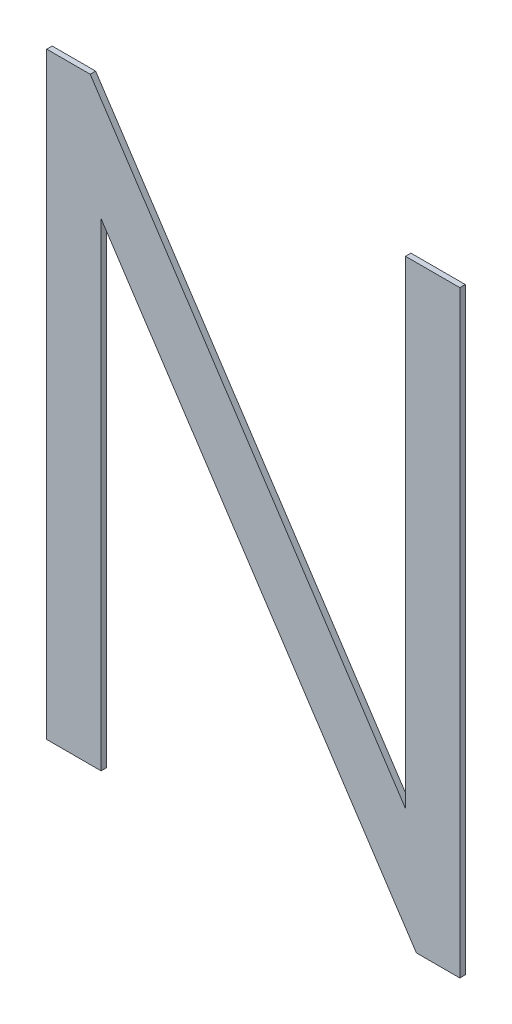
ISO-10303-21;
HEADER;
FILE_DESCRIPTION(('STEP AP214'),'2;1');
FILE_NAME('part.step','',(''),(''),'','','');
FILE_SCHEMA(('AUTOMOTIVE_DESIGN { 1 0 10303 214 1 1 1 1 }'));
ENDSEC;
DATA;
#1=APPLICATION_CONTEXT('core data for automotive mechanical design processes');
#2=APPLICATION_PROTOCOL_DEFINITION('international standard','automotive_design',2000,#1);
#3=PRODUCT_CONTEXT('',#1,'mechanical');
#4=PRODUCT('Part','Part','',(#3));
#5=PRODUCT_RELATED_PRODUCT_CATEGORY('part','',(#4));
#6=PRODUCT_DEFINITION_FORMATION('','',#4);
#7=PRODUCT_DEFINITION_CONTEXT('part definition',#1,'design');
#8=PRODUCT_DEFINITION('design','',#6,#7);
#9=PRODUCT_DEFINITION_SHAPE('','',#8);
#10=(LENGTH_UNIT() NAMED_UNIT(*) SI_UNIT(.MILLI.,.METRE.));
#11=(NAMED_UNIT(*) PLANE_ANGLE_UNIT() SI_UNIT($,.RADIAN.));
#12=(NAMED_UNIT(*) SI_UNIT($,.STERADIAN.) SOLID_ANGLE_UNIT());
#13=UNCERTAINTY_MEASURE_WITH_UNIT(LENGTH_MEASURE(1.E-05),#10,'distance_accuracy_value','');
#14=(GEOMETRIC_REPRESENTATION_CONTEXT(3) GLOBAL_UNCERTAINTY_ASSIGNED_CONTEXT((#13)) GLOBAL_UNIT_ASSIGNED_CONTEXT((#10,
#11,#12)) REPRESENTATION_CONTEXT('',''));
#15=CARTESIAN_POINT('',(0.,0.,0.));
#16=DIRECTION('',(0.,0.,1.));
#17=DIRECTION('',(1.,0.,0.));
#18=AXIS2_PLACEMENT_3D('',#15,#16,#17);
#19=CARTESIAN_POINT('',(-0.37999924,-0.5499989,0.01));
#20=DIRECTION('',(0.,0.,1.));
#21=DIRECTION('',(1.,0.,0.));
#22=AXIS2_PLACEMENT_3D('',#19,#20,#21);
#23=PLANE('',#22);
#24=DIRECTION('',(1.,0.,0.));
#25=VECTOR('',#24,1.);
#26=CARTESIAN_POINT('',(-0.37999924,0.55000144,0.01));
#27=LINE('',#26,#25);
#28=CARTESIAN_POINT('',(-0.37999924,0.55000144,0.01));
#29=VERTEX_POINT('',#28);
#30=CARTESIAN_POINT('',(-0.2999994,0.55000144,0.01));
#31=VERTEX_POINT('',#30);
#32=EDGE_CURVE('E137',#29,#31,#27,.T.);
#33=ORIENTED_EDGE('',*,*,#32,.F.);
#34=DIRECTION('',(0.,1.,0.));
#35=VECTOR('',#34,1.);
#36=CARTESIAN_POINT('',(-0.37999924,-0.5499989,0.01));
#37=LINE('',#36,#35);
#38=CARTESIAN_POINT('',(-0.37999924,-0.5499989,0.01));
#39=VERTEX_POINT('',#38);
#40=EDGE_CURVE('E106',#39,#29,#37,.T.);
#41=ORIENTED_EDGE('',*,*,#40,.F.);
#42=DIRECTION('',(1.,0.,0.));
#43=VECTOR('',#42,1.);
#44=CARTESIAN_POINT('',(-0.27999944,-0.5499989,0.01));
#45=LINE('',#44,#43);
#46=CARTESIAN_POINT('',(-0.27999944,-0.5499989,0.01));
#47=VERTEX_POINT('',#46);
#48=EDGE_CURVE('E20',#47,#39,#45,.F.);
#49=ORIENTED_EDGE('',*,*,#48,.F.);
#50=DIRECTION('',(0.,1.,0.));
#51=VECTOR('',#50,1.);
#52=CARTESIAN_POINT('',(-0.27999944,0.33000188,0.01));
#53=LINE('',#52,#51);
#54=CARTESIAN_POINT('',(-0.279999440000009,0.330001879999994,0.01));
#55=VERTEX_POINT('',#54);
#56=EDGE_CURVE('E95',#55,#47,#53,.F.);
#57=ORIENTED_EDGE('',*,*,#56,.F.);
#58=DIRECTION('',(0.55031225476894,-0.834958934469909,0.));
#59=VECTOR('',#58,1.);
#60=CARTESIAN_POINT('',(0.2999994,-0.5499989,0.01));
#61=LINE('',#60,#59);
#62=CARTESIAN_POINT('',(0.2999994,-0.5499989,0.01));
#63=VERTEX_POINT('',#62);
#64=EDGE_CURVE('E90',#63,#55,#61,.F.);
#65=ORIENTED_EDGE('',*,*,#64,.F.);
#66=DIRECTION('',(1.,0.,0.));
#67=VECTOR('',#66,1.);
#68=CARTESIAN_POINT('',(0.37999924,-0.5499989,0.01));
#69=LINE('',#68,#67);
#70=CARTESIAN_POINT('',(0.37999924,-0.5499989,0.01));
#71=VERTEX_POINT('',#70);
#72=EDGE_CURVE('E117',#71,#63,#69,.F.);
#73=ORIENTED_EDGE('',*,*,#72,.F.);
#74=DIRECTION('',(0.,1.,0.));
#75=VECTOR('',#74,1.);
#76=CARTESIAN_POINT('',(0.37999924,0.55000144,0.01));
#77=LINE('',#76,#75);
#78=CARTESIAN_POINT('',(0.37999924,0.55000144,0.01));
#79=VERTEX_POINT('',#78);
#80=EDGE_CURVE('E121',#79,#71,#77,.F.);
#81=ORIENTED_EDGE('',*,*,#80,.F.);
#82=DIRECTION('',(1.,0.,0.));
#83=VECTOR('',#82,1.);
#84=CARTESIAN_POINT('',(0.27999944,0.55000144,0.01));
#85=LINE('',#84,#83);
#86=CARTESIAN_POINT('',(0.27999944,0.55000144,0.01));
#87=VERTEX_POINT('',#86);
#88=EDGE_CURVE('E125',#87,#79,#85,.T.);
#89=ORIENTED_EDGE('',*,*,#88,.F.);
#90=DIRECTION('',(0.,1.,0.));
#91=VECTOR('',#90,1.);
#92=CARTESIAN_POINT('',(0.27999944,-0.32999934,0.01));
#93=LINE('',#92,#91);
#94=CARTESIAN_POINT('',(0.279999440000009,-0.329999339999994,0.01));
#95=VERTEX_POINT('',#94);
#96=EDGE_CURVE('E129',#95,#87,#93,.T.);
#97=ORIENTED_EDGE('',*,*,#96,.F.);
#98=DIRECTION('',(-0.55031225476894,0.834958934469909,0.));
#99=VECTOR('',#98,1.);
#100=CARTESIAN_POINT('',(-0.2999994,0.55000144,0.01));
#101=LINE('',#100,#99);
#102=EDGE_CURVE('E133',#31,#95,#101,.F.);
#103=ORIENTED_EDGE('',*,*,#102,.F.);
#104=EDGE_LOOP('',(#33,#41,#49,#57,#65,#73,#81,#89,#97,#103));
#105=FACE_BOUND('',#104,.T.);
#106=ADVANCED_FACE('F17',(#105),#23,.T.);
#107=CARTESIAN_POINT('',(-0.27999944,-0.5499989,0.));
#108=DIRECTION('',(0.,-1.,0.));
#109=DIRECTION('',(0.,0.,-1.));
#110=AXIS2_PLACEMENT_3D('',#107,#108,#109);
#111=PLANE('',#110);
#112=DIRECTION('',(0.,0.,1.));
#113=VECTOR('',#112,1.);
#114=CARTESIAN_POINT('',(-0.37999924,-0.5499989,0.));
#115=LINE('',#114,#113);
#116=CARTESIAN_POINT('',(-0.37999924,-0.5499989,0.));
#117=VERTEX_POINT('',#116);
#118=EDGE_CURVE('E141',#117,#39,#115,.T.);
#119=ORIENTED_EDGE('',*,*,#118,.F.);
#120=DIRECTION('',(1.,0.,0.));
#121=VECTOR('',#120,1.);
#122=CARTESIAN_POINT('',(-0.37999924,-0.5499989,0.));
#123=LINE('',#122,#121);
#124=CARTESIAN_POINT('',(-0.27999944,-0.5499989,0.));
#125=VERTEX_POINT('',#124);
#126=EDGE_CURVE('E112',#117,#125,#123,.T.);
#127=ORIENTED_EDGE('',*,*,#126,.T.);
#128=DIRECTION('',(0.,0.,-1.));
#129=VECTOR('',#128,1.);
#130=CARTESIAN_POINT('',(-0.27999944,-0.5499989,0.));
#131=LINE('',#130,#129);
#132=EDGE_CURVE('E100',#47,#125,#131,.T.);
#133=ORIENTED_EDGE('',*,*,#132,.F.);
#134=ORIENTED_EDGE('',*,*,#48,.T.);
#135=EDGE_LOOP('',(#119,#127,#133,#134));
#136=FACE_BOUND('',#135,.T.);
#137=ADVANCED_FACE('F111',(#136),#111,.T.);
#138=CARTESIAN_POINT('',(-0.27999944,0.33000188,0.));
#139=DIRECTION('',(1.,0.,0.));
#140=DIRECTION('',(0.,0.,-1.));
#141=AXIS2_PLACEMENT_3D('',#138,#139,#140);
#142=PLANE('',#141);
#143=ORIENTED_EDGE('',*,*,#132,.T.);
#144=DIRECTION('',(0.,1.,0.));
#145=VECTOR('',#144,1.);
#146=CARTESIAN_POINT('',(-0.27999944,-0.5499989,0.));
#147=LINE('',#146,#145);
#148=CARTESIAN_POINT('',(-0.279999440000009,0.330001879999994,0.));
#149=VERTEX_POINT('',#148);
#150=EDGE_CURVE('E146',#125,#149,#147,.T.);
#151=ORIENTED_EDGE('',*,*,#150,.T.);
#152=DIRECTION('',(0.,0.,1.));
#153=VECTOR('',#152,1.);
#154=CARTESIAN_POINT('',(-0.279999440000036,0.330001879999976,0.));
#155=LINE('',#154,#153);
#156=EDGE_CURVE('E102',#55,#149,#155,.F.);
#157=ORIENTED_EDGE('',*,*,#156,.F.);
#158=ORIENTED_EDGE('',*,*,#56,.T.);
#159=EDGE_LOOP('',(#143,#151,#157,#158));
#160=FACE_BOUND('',#159,.T.);
#161=ADVANCED_FACE('F97',(#160),#142,.T.);
#162=CARTESIAN_POINT('',(0.2999994,-0.5499989,0.));
#163=DIRECTION('',(-0.834958934469909,-0.55031225476894,0.));
#164=DIRECTION('',(0.55031225476894,-0.834958934469909,0.));
#165=AXIS2_PLACEMENT_3D('',#162,#163,#164);
#166=PLANE('',#165);
#167=ORIENTED_EDGE('',*,*,#156,.T.);
#168=DIRECTION('',(0.550312254768906,-0.834958934469931,0.));
#169=VECTOR('',#168,1.);
#170=CARTESIAN_POINT('',(-0.27999944,0.33000188,0.));
#171=LINE('',#170,#169);
#172=CARTESIAN_POINT('',(0.2999994,-0.5499989,0.));
#173=VERTEX_POINT('',#172);
#174=EDGE_CURVE('E148',#149,#173,#171,.T.);
#175=ORIENTED_EDGE('',*,*,#174,.T.);
#176=DIRECTION('',(0.,0.,-1.));
#177=VECTOR('',#176,1.);
#178=CARTESIAN_POINT('',(0.2999994,-0.5499989,0.));
#179=LINE('',#178,#177);
#180=EDGE_CURVE('E119',#63,#173,#179,.T.);
#181=ORIENTED_EDGE('',*,*,#180,.F.);
#182=ORIENTED_EDGE('',*,*,#64,.T.);
#183=EDGE_LOOP('',(#167,#175,#181,#182));
#184=FACE_BOUND('',#183,.T.);
#185=ADVANCED_FACE('F198',(#184),#166,.T.);
#186=CARTESIAN_POINT('',(0.37999924,-0.5499989,0.));
#187=DIRECTION('',(0.,-1.,0.));
#188=DIRECTION('',(0.,0.,-1.));
#189=AXIS2_PLACEMENT_3D('',#186,#187,#188);
#190=PLANE('',#189);
#191=ORIENTED_EDGE('',*,*,#180,.T.);
#192=DIRECTION('',(1.,0.,0.));
#193=VECTOR('',#192,1.);
#194=CARTESIAN_POINT('',(-0.37999924,-0.5499989,0.));
#195=LINE('',#194,#193);
#196=CARTESIAN_POINT('',(0.37999924,-0.5499989,0.));
#197=VERTEX_POINT('',#196);
#198=EDGE_CURVE('E151',#173,#197,#195,.T.);
#199=ORIENTED_EDGE('',*,*,#198,.T.);
#200=DIRECTION('',(0.,0.,-1.));
#201=VECTOR('',#200,1.);
#202=CARTESIAN_POINT('',(0.37999924,-0.5499989,0.));
#203=LINE('',#202,#201);
#204=EDGE_CURVE('E123',#71,#197,#203,.T.);
#205=ORIENTED_EDGE('',*,*,#204,.F.);
#206=ORIENTED_EDGE('',*,*,#72,.T.);
#207=EDGE_LOOP('',(#191,#199,#205,#206));
#208=FACE_BOUND('',#207,.T.);
#209=ADVANCED_FACE('F197',(#208),#190,.T.);
#210=CARTESIAN_POINT('',(0.37999924,0.55000144,0.));
#211=DIRECTION('',(1.,0.,0.));
#212=DIRECTION('',(0.,0.,-1.));
#213=AXIS2_PLACEMENT_3D('',#210,#211,#212);
#214=PLANE('',#213);
#215=ORIENTED_EDGE('',*,*,#204,.T.);
#216=DIRECTION('',(0.,1.,0.));
#217=VECTOR('',#216,1.);
#218=CARTESIAN_POINT('',(0.37999924,-0.5499989,0.));
#219=LINE('',#218,#217);
#220=CARTESIAN_POINT('',(0.37999924,0.55000144,0.));
#221=VERTEX_POINT('',#220);
#222=EDGE_CURVE('E154',#197,#221,#219,.T.);
#223=ORIENTED_EDGE('',*,*,#222,.T.);
#224=DIRECTION('',(0.,0.,1.));
#225=VECTOR('',#224,1.);
#226=CARTESIAN_POINT('',(0.37999924,0.55000144,0.));
#227=LINE('',#226,#225);
#228=EDGE_CURVE('E127',#79,#221,#227,.F.);
#229=ORIENTED_EDGE('',*,*,#228,.F.);
#230=ORIENTED_EDGE('',*,*,#80,.T.);
#231=EDGE_LOOP('',(#215,#223,#229,#230));
#232=FACE_BOUND('',#231,.T.);
#233=ADVANCED_FACE('F191',(#232),#214,.T.);
#234=CARTESIAN_POINT('',(0.27999944,0.55000144,0.));
#235=DIRECTION('',(0.,1.,0.));
#236=DIRECTION('',(0.,0.,1.));
#237=AXIS2_PLACEMENT_3D('',#234,#235,#236);
#238=PLANE('',#237);
#239=ORIENTED_EDGE('',*,*,#228,.T.);
#240=DIRECTION('',(1.,0.,0.));
#241=VECTOR('',#240,1.);
#242=CARTESIAN_POINT('',(-0.37999924,0.55000144,0.));
#243=LINE('',#242,#241);
#244=CARTESIAN_POINT('',(0.27999944,0.55000144,0.));
#245=VERTEX_POINT('',#244);
#246=EDGE_CURVE('E157',#221,#245,#243,.F.);
#247=ORIENTED_EDGE('',*,*,#246,.T.);
#248=DIRECTION('',(0.,0.,1.));
#249=VECTOR('',#248,1.);
#250=CARTESIAN_POINT('',(0.27999944,0.55000144,0.));
#251=LINE('',#250,#249);
#252=EDGE_CURVE('E131',#87,#245,#251,.F.);
#253=ORIENTED_EDGE('',*,*,#252,.F.);
#254=ORIENTED_EDGE('',*,*,#88,.T.);
#255=EDGE_LOOP('',(#239,#247,#253,#254));
#256=FACE_BOUND('',#255,.T.);
#257=ADVANCED_FACE('F187',(#256),#238,.T.);
#258=CARTESIAN_POINT('',(0.27999944,-0.32999934,0.));
#259=DIRECTION('',(-1.,0.,0.));
#260=DIRECTION('',(0.,0.,1.));
#261=AXIS2_PLACEMENT_3D('',#258,#259,#260);
#262=PLANE('',#261);
#263=ORIENTED_EDGE('',*,*,#252,.T.);
#264=DIRECTION('',(0.,1.,0.));
#265=VECTOR('',#264,1.);
#266=CARTESIAN_POINT('',(0.27999944,-0.5499989,0.));
#267=LINE('',#266,#265);
#268=CARTESIAN_POINT('',(0.279999440000009,-0.329999339999994,0.));
#269=VERTEX_POINT('',#268);
#270=EDGE_CURVE('E160',#245,#269,#267,.F.);
#271=ORIENTED_EDGE('',*,*,#270,.T.);
#272=DIRECTION('',(0.,0.,1.));
#273=VECTOR('',#272,1.);
#274=CARTESIAN_POINT('',(0.279999440000036,-0.329999339999976,0.));
#275=LINE('',#274,#273);
#276=EDGE_CURVE('E135',#95,#269,#275,.F.);
#277=ORIENTED_EDGE('',*,*,#276,.F.);
#278=ORIENTED_EDGE('',*,*,#96,.T.);
#279=EDGE_LOOP('',(#263,#271,#277,#278));
#280=FACE_BOUND('',#279,.T.);
#281=ADVANCED_FACE('F181',(#280),#262,.T.);
#282=CARTESIAN_POINT('',(-0.2999994,0.55000144,0.));
#283=DIRECTION('',(0.834958934469909,0.55031225476894,0.));
#284=DIRECTION('',(-0.55031225476894,0.834958934469909,0.));
#285=AXIS2_PLACEMENT_3D('',#282,#283,#284);
#286=PLANE('',#285);
#287=ORIENTED_EDGE('',*,*,#276,.T.);
#288=DIRECTION('',(-0.550312254768906,0.834958934469931,0.));
#289=VECTOR('',#288,1.);
#290=CARTESIAN_POINT('',(0.27999944,-0.32999934,0.));
#291=LINE('',#290,#289);
#292=CARTESIAN_POINT('',(-0.2999994,0.55000144,0.));
#293=VERTEX_POINT('',#292);
#294=EDGE_CURVE('E163',#269,#293,#291,.T.);
#295=ORIENTED_EDGE('',*,*,#294,.T.);
#296=DIRECTION('',(0.,0.,1.));
#297=VECTOR('',#296,1.);
#298=CARTESIAN_POINT('',(-0.2999994,0.55000144,0.));
#299=LINE('',#298,#297);
#300=EDGE_CURVE('E139',#31,#293,#299,.F.);
#301=ORIENTED_EDGE('',*,*,#300,.F.);
#302=ORIENTED_EDGE('',*,*,#102,.T.);
#303=EDGE_LOOP('',(#287,#295,#301,#302));
#304=FACE_BOUND('',#303,.T.);
#305=ADVANCED_FACE('F176',(#304),#286,.T.);
#306=CARTESIAN_POINT('',(-0.37999924,0.55000144,0.));
#307=DIRECTION('',(0.,1.,0.));
#308=DIRECTION('',(0.,0.,1.));
#309=AXIS2_PLACEMENT_3D('',#306,#307,#308);
#310=PLANE('',#309);
#311=ORIENTED_EDGE('',*,*,#300,.T.);
#312=DIRECTION('',(1.,0.,0.));
#313=VECTOR('',#312,1.);
#314=CARTESIAN_POINT('',(-0.37999924,0.55000144,0.));
#315=LINE('',#314,#313);
#316=CARTESIAN_POINT('',(-0.37999924,0.55000144,0.));
#317=VERTEX_POINT('',#316);
#318=EDGE_CURVE('E26',#293,#317,#315,.F.);
#319=ORIENTED_EDGE('',*,*,#318,.T.);
#320=DIRECTION('',(0.,0.,1.));
#321=VECTOR('',#320,1.);
#322=CARTESIAN_POINT('',(-0.37999924,0.55000144,0.));
#323=LINE('',#322,#321);
#324=EDGE_CURVE('E34',#29,#317,#323,.F.);
#325=ORIENTED_EDGE('',*,*,#324,.F.);
#326=ORIENTED_EDGE('',*,*,#32,.T.);
#327=EDGE_LOOP('',(#311,#319,#325,#326));
#328=FACE_BOUND('',#327,.T.);
#329=ADVANCED_FACE('F169',(#328),#310,.T.);
#330=CARTESIAN_POINT('',(-0.37999924,-0.5499989,0.));
#331=DIRECTION('',(-1.,0.,0.));
#332=DIRECTION('',(0.,0.,1.));
#333=AXIS2_PLACEMENT_3D('',#330,#331,#332);
#334=PLANE('',#333);
#335=ORIENTED_EDGE('',*,*,#324,.T.);
#336=DIRECTION('',(0.,1.,0.));
#337=VECTOR('',#336,1.);
#338=CARTESIAN_POINT('',(-0.37999924,-0.5499989,0.));
#339=LINE('',#338,#337);
#340=EDGE_CURVE('E11',#317,#117,#339,.F.);
#341=ORIENTED_EDGE('',*,*,#340,.T.);
#342=ORIENTED_EDGE('',*,*,#118,.T.);
#343=ORIENTED_EDGE('',*,*,#40,.T.);
#344=EDGE_LOOP('',(#335,#341,#342,#343));
#345=FACE_BOUND('',#344,.T.);
#346=ADVANCED_FACE('F199',(#345),#334,.T.);
#347=CARTESIAN_POINT('',(-0.37999924,-0.5499989,0.));
#348=DIRECTION('',(0.,0.,1.));
#349=DIRECTION('',(1.,0.,0.));
#350=AXIS2_PLACEMENT_3D('',#347,#348,#349);
#351=PLANE('',#350);
#352=ORIENTED_EDGE('',*,*,#318,.F.);
#353=ORIENTED_EDGE('',*,*,#294,.F.);
#354=ORIENTED_EDGE('',*,*,#270,.F.);
#355=ORIENTED_EDGE('',*,*,#246,.F.);
#356=ORIENTED_EDGE('',*,*,#222,.F.);
#357=ORIENTED_EDGE('',*,*,#198,.F.);
#358=ORIENTED_EDGE('',*,*,#174,.F.);
#359=ORIENTED_EDGE('',*,*,#150,.F.);
#360=ORIENTED_EDGE('',*,*,#126,.F.);
#361=ORIENTED_EDGE('',*,*,#340,.F.);
#362=EDGE_LOOP('',(#352,#353,#354,#355,#356,#357,#358,#359,#360,#361));
#363=FACE_BOUND('',#362,.T.);
#364=ADVANCED_FACE('F173',(#363),#351,.F.);
#365=CLOSED_SHELL('',(#106,#137,#161,#185,#209,#233,#257,#281,#305,#329,#346,#364));
#366=MANIFOLD_SOLID_BREP('B1',#365);
#367=ADVANCED_BREP_SHAPE_REPRESENTATION('',(#18,#366),#14);
#368=SHAPE_DEFINITION_REPRESENTATION(#9,#367);
ENDSEC;
END-ISO-10303-21;
